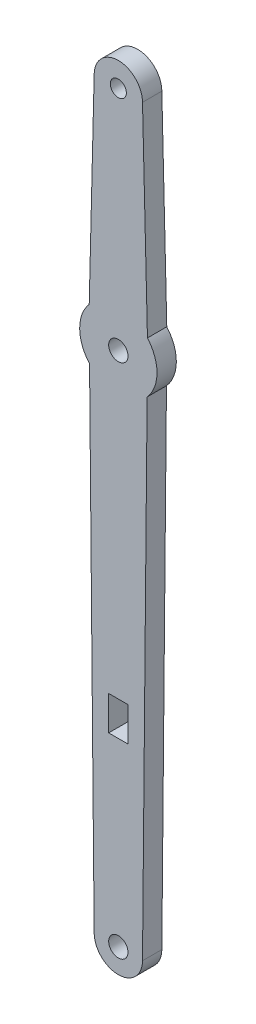
ISO-10303-21;
HEADER;
FILE_DESCRIPTION(('STEP AP214'),'2;1');
FILE_NAME('part.step','',(''),(''),'','','');
FILE_SCHEMA(('AUTOMOTIVE_DESIGN { 1 0 10303 214 1 1 1 1 }'));
ENDSEC;
DATA;
#1=APPLICATION_CONTEXT('core data for automotive mechanical design processes');
#2=APPLICATION_PROTOCOL_DEFINITION('international standard','automotive_design',2000,#1);
#3=PRODUCT_CONTEXT('',#1,'mechanical');
#4=PRODUCT('Part','Part','',(#3));
#5=PRODUCT_RELATED_PRODUCT_CATEGORY('part','',(#4));
#6=PRODUCT_DEFINITION_FORMATION('','',#4);
#7=PRODUCT_DEFINITION_CONTEXT('part definition',#1,'design');
#8=PRODUCT_DEFINITION('design','',#6,#7);
#9=PRODUCT_DEFINITION_SHAPE('','',#8);
#10=(LENGTH_UNIT() NAMED_UNIT(*) SI_UNIT(.MILLI.,.METRE.));
#11=(NAMED_UNIT(*) PLANE_ANGLE_UNIT() SI_UNIT($,.RADIAN.));
#12=(NAMED_UNIT(*) SI_UNIT($,.STERADIAN.) SOLID_ANGLE_UNIT());
#13=UNCERTAINTY_MEASURE_WITH_UNIT(LENGTH_MEASURE(1.E-05),#10,'distance_accuracy_value','');
#14=(GEOMETRIC_REPRESENTATION_CONTEXT(3) GLOBAL_UNCERTAINTY_ASSIGNED_CONTEXT((#13)) GLOBAL_UNIT_ASSIGNED_CONTEXT((#10,
#11,#12)) REPRESENTATION_CONTEXT('',''));
#15=CARTESIAN_POINT('',(0.,0.,0.));
#16=DIRECTION('',(0.,0.,1.));
#17=DIRECTION('',(1.,0.,0.));
#18=AXIS2_PLACEMENT_3D('',#15,#16,#17);
#19=CARTESIAN_POINT('',(202.82681688808,948.560738026491,-3.));
#20=DIRECTION('',(0.,0.,1.));
#21=DIRECTION('',(1.,0.,0.));
#22=AXIS2_PLACEMENT_3D('',#19,#20,#21);
#23=CYLINDRICAL_SURFACE('',#22,6.00000000000054);
#24=CARTESIAN_POINT('',(202.82681688808,948.560738026491,0.));
#25=DIRECTION('',(0.,0.,1.));
#26=DIRECTION('',(-1.,0.,0.));
#27=AXIS2_PLACEMENT_3D('',#24,#25,#26);
#28=CIRCLE('',#27,6.00000000000054);
#29=CARTESIAN_POINT('',(198.308869226963,952.508921017617,0.));
#30=VERTEX_POINT('',#29);
#31=CARTESIAN_POINT('',(198.360659981847,944.554063284401,0.));
#32=VERTEX_POINT('',#31);
#33=EDGE_CURVE('E179',#30,#32,#28,.T.);
#34=ORIENTED_EDGE('',*,*,#33,.F.);
#35=DIRECTION('',(0.,0.,1.));
#36=VECTOR('',#35,1.);
#37=CARTESIAN_POINT('',(198.308869226963,952.508921017617,-3.));
#38=LINE('',#37,#36);
#39=CARTESIAN_POINT('',(198.308869226963,952.508921017617,-3.));
#40=VERTEX_POINT('',#39);
#41=EDGE_CURVE('E11',#40,#30,#38,.T.);
#42=ORIENTED_EDGE('',*,*,#41,.F.);
#43=CARTESIAN_POINT('',(202.82681688808,948.560738026491,-3.));
#44=DIRECTION('',(0.,0.,1.));
#45=DIRECTION('',(-1.,0.,0.));
#46=AXIS2_PLACEMENT_3D('',#43,#44,#45);
#47=CIRCLE('',#46,6.00000000000054);
#48=CARTESIAN_POINT('',(198.360659981847,944.554063284401,-3.));
#49=VERTEX_POINT('',#48);
#50=EDGE_CURVE('E182',#40,#49,#47,.T.);
#51=ORIENTED_EDGE('',*,*,#50,.T.);
#52=DIRECTION('',(0.,0.,1.));
#53=VECTOR('',#52,1.);
#54=CARTESIAN_POINT('',(198.360659981847,944.554063284401,-3.));
#55=LINE('',#54,#53);
#56=EDGE_CURVE('E43',#49,#32,#55,.T.);
#57=ORIENTED_EDGE('',*,*,#56,.T.);
#58=EDGE_LOOP('',(#34,#42,#51,#57));
#59=FACE_BOUND('',#58,.T.);
#60=ADVANCED_FACE('F40',(#59),#23,.T.);
#61=CARTESIAN_POINT('',(198.308869226963,952.508921017617,-3.));
#62=DIRECTION('',(-0.99969884595477,0.0245401181069235,0.));
#63=DIRECTION('',(-0.0245401181069235,-0.99969884595477,0.));
#64=AXIS2_PLACEMENT_3D('',#61,#62,#63);
#65=PLANE('',#64);
#66=DIRECTION('',(-0.0245401181069235,-0.99969884595477,0.));
#67=VECTOR('',#66,1.);
#68=CARTESIAN_POINT('',(198.308869226963,952.508921017617,0.));
#69=LINE('',#68,#67);
#70=CARTESIAN_POINT('',(199.07681688808,983.793056946648,0.));
#71=VERTEX_POINT('',#70);
#72=EDGE_CURVE('E186',#71,#30,#69,.T.);
#73=ORIENTED_EDGE('',*,*,#72,.F.);
#74=DIRECTION('',(0.,0.,1.));
#75=VECTOR('',#74,1.);
#76=CARTESIAN_POINT('',(199.07681688808,983.793056946648,-3.));
#77=LINE('',#76,#75);
#78=CARTESIAN_POINT('',(199.07681688808,983.793056946648,-3.));
#79=VERTEX_POINT('',#78);
#80=EDGE_CURVE('E48',#79,#71,#77,.T.);
#81=ORIENTED_EDGE('',*,*,#80,.F.);
#82=DIRECTION('',(-0.0245401181069235,-0.99969884595477,0.));
#83=VECTOR('',#82,1.);
#84=CARTESIAN_POINT('',(198.308869226963,952.508921017617,-3.));
#85=LINE('',#84,#83);
#86=EDGE_CURVE('E204',#79,#40,#85,.T.);
#87=ORIENTED_EDGE('',*,*,#86,.T.);
#88=ORIENTED_EDGE('',*,*,#41,.T.);
#89=EDGE_LOOP('',(#73,#81,#87,#88));
#90=FACE_BOUND('',#89,.T.);
#91=ADVANCED_FACE('F251',(#90),#65,.T.);
#92=CARTESIAN_POINT('',(202.82681688808,983.793056946648,-3.));
#93=DIRECTION('',(0.,0.,1.));
#94=DIRECTION('',(1.,0.,0.));
#95=AXIS2_PLACEMENT_3D('',#92,#93,#94);
#96=CYLINDRICAL_SURFACE('',#95,3.75);
#97=CARTESIAN_POINT('',(202.82681688808,983.793056946648,0.));
#98=DIRECTION('',(0.,0.,1.));
#99=DIRECTION('',(-1.,0.,0.));
#100=AXIS2_PLACEMENT_3D('',#97,#98,#99);
#101=CIRCLE('',#100,3.75);
#102=CARTESIAN_POINT('',(206.57681688808,983.793056946648,0.));
#103=VERTEX_POINT('',#102);
#104=EDGE_CURVE('E224',#103,#71,#101,.T.);
#105=ORIENTED_EDGE('',*,*,#104,.F.);
#106=DIRECTION('',(0.,0.,1.));
#107=VECTOR('',#106,1.);
#108=CARTESIAN_POINT('',(206.57681688808,983.793056946648,-3.));
#109=LINE('',#108,#107);
#110=CARTESIAN_POINT('',(206.57681688808,983.793056946648,-3.));
#111=VERTEX_POINT('',#110);
#112=EDGE_CURVE('E230',#111,#103,#109,.T.);
#113=ORIENTED_EDGE('',*,*,#112,.F.);
#114=CARTESIAN_POINT('',(202.82681688808,983.793056946648,-3.));
#115=DIRECTION('',(0.,0.,1.));
#116=DIRECTION('',(-1.,0.,0.));
#117=AXIS2_PLACEMENT_3D('',#114,#115,#116);
#118=CIRCLE('',#117,3.75);
#119=EDGE_CURVE('E201',#111,#79,#118,.T.);
#120=ORIENTED_EDGE('',*,*,#119,.T.);
#121=ORIENTED_EDGE('',*,*,#80,.T.);
#122=EDGE_LOOP('',(#105,#113,#120,#121));
#123=FACE_BOUND('',#122,.T.);
#124=ADVANCED_FACE('F271',(#123),#96,.T.);
#125=CARTESIAN_POINT('',(207.344764549196,952.508921017617,-3.));
#126=DIRECTION('',(0.99969884595477,0.02454011810692,0.));
#127=DIRECTION('',(-0.02454011810692,0.99969884595477,0.));
#128=AXIS2_PLACEMENT_3D('',#125,#126,#127);
#129=PLANE('',#128);
#130=DIRECTION('',(-0.02454011810692,0.99969884595477,0.));
#131=VECTOR('',#130,1.);
#132=CARTESIAN_POINT('',(207.344764549196,952.508921017617,0.));
#133=LINE('',#132,#131);
#134=CARTESIAN_POINT('',(207.344764549196,952.508921017617,0.));
#135=VERTEX_POINT('',#134);
#136=EDGE_CURVE('E221',#135,#103,#133,.T.);
#137=ORIENTED_EDGE('',*,*,#136,.F.);
#138=DIRECTION('',(0.,0.,1.));
#139=VECTOR('',#138,1.);
#140=CARTESIAN_POINT('',(207.344764549196,952.508921017617,-3.));
#141=LINE('',#140,#139);
#142=CARTESIAN_POINT('',(207.344764549196,952.508921017617,-3.));
#143=VERTEX_POINT('',#142);
#144=EDGE_CURVE('E232',#143,#135,#141,.T.);
#145=ORIENTED_EDGE('',*,*,#144,.F.);
#146=DIRECTION('',(-0.02454011810692,0.99969884595477,0.));
#147=VECTOR('',#146,1.);
#148=CARTESIAN_POINT('',(207.344764549196,952.508921017617,-3.));
#149=LINE('',#148,#147);
#150=EDGE_CURVE('E198',#143,#111,#149,.T.);
#151=ORIENTED_EDGE('',*,*,#150,.T.);
#152=ORIENTED_EDGE('',*,*,#112,.T.);
#153=EDGE_LOOP('',(#137,#145,#151,#152));
#154=FACE_BOUND('',#153,.T.);
#155=ADVANCED_FACE('F269',(#154),#129,.T.);
#156=CARTESIAN_POINT('',(202.82681688808,948.560738026492,-3.));
#157=DIRECTION('',(0.,0.,1.));
#158=DIRECTION('',(1.,0.,0.));
#159=AXIS2_PLACEMENT_3D('',#156,#157,#158);
#160=CYLINDRICAL_SURFACE('',#159,5.99999999999978);
#161=CARTESIAN_POINT('',(202.82681688808,948.560738026492,0.));
#162=DIRECTION('',(0.,0.,1.));
#163=DIRECTION('',(-1.,0.,0.));
#164=AXIS2_PLACEMENT_3D('',#161,#162,#163);
#165=CIRCLE('',#164,5.99999999999978);
#166=CARTESIAN_POINT('',(207.294357708213,944.555606440583,0.));
#167=VERTEX_POINT('',#166);
#168=EDGE_CURVE('E218',#167,#135,#165,.T.);
#169=ORIENTED_EDGE('',*,*,#168,.F.);
#170=DIRECTION('',(0.,0.,1.));
#171=VECTOR('',#170,1.);
#172=CARTESIAN_POINT('',(207.294357708213,944.555606440583,-3.));
#173=LINE('',#172,#171);
#174=CARTESIAN_POINT('',(207.294357708213,944.555606440583,-3.));
#175=VERTEX_POINT('',#174);
#176=EDGE_CURVE('E234',#175,#167,#173,.T.);
#177=ORIENTED_EDGE('',*,*,#176,.F.);
#178=CARTESIAN_POINT('',(202.82681688808,948.560738026492,-3.));
#179=DIRECTION('',(0.,0.,1.));
#180=DIRECTION('',(-1.,0.,0.));
#181=AXIS2_PLACEMENT_3D('',#178,#179,#180);
#182=CIRCLE('',#181,5.99999999999978);
#183=EDGE_CURVE('E195',#175,#143,#182,.T.);
#184=ORIENTED_EDGE('',*,*,#183,.T.);
#185=ORIENTED_EDGE('',*,*,#144,.T.);
#186=EDGE_LOOP('',(#169,#177,#184,#185));
#187=FACE_BOUND('',#186,.T.);
#188=ADVANCED_FACE('F265',(#187),#160,.T.);
#189=CARTESIAN_POINT('',(207.294357708213,944.555606440583,-3.));
#190=DIRECTION('',(0.99995558710895,-0.00942463843314179,0.));
#191=DIRECTION('',(0.00942463843314179,0.99995558710895,0.));
#192=AXIS2_PLACEMENT_3D('',#189,#190,#191);
#193=PLANE('',#192);
#194=DIRECTION('',(0.00942463843314179,0.99995558710895,0.));
#195=VECTOR('',#194,1.);
#196=CARTESIAN_POINT('',(207.294357708213,944.555606440583,0.));
#197=LINE('',#196,#195);
#198=CARTESIAN_POINT('',(206.57681688808,868.424415078559,0.));
#199=VERTEX_POINT('',#198);
#200=EDGE_CURVE('E215',#199,#167,#197,.T.);
#201=ORIENTED_EDGE('',*,*,#200,.F.);
#202=DIRECTION('',(0.,0.,1.));
#203=VECTOR('',#202,1.);
#204=CARTESIAN_POINT('',(206.57681688808,868.424415078559,-3.));
#205=LINE('',#204,#203);
#206=CARTESIAN_POINT('',(206.57681688808,868.424415078559,-3.));
#207=VERTEX_POINT('',#206);
#208=EDGE_CURVE('E236',#207,#199,#205,.T.);
#209=ORIENTED_EDGE('',*,*,#208,.F.);
#210=DIRECTION('',(0.00942463843314179,0.99995558710895,0.));
#211=VECTOR('',#210,1.);
#212=CARTESIAN_POINT('',(207.294357708213,944.555606440583,-3.));
#213=LINE('',#212,#211);
#214=EDGE_CURVE('E192',#207,#175,#213,.T.);
#215=ORIENTED_EDGE('',*,*,#214,.T.);
#216=ORIENTED_EDGE('',*,*,#176,.T.);
#217=EDGE_LOOP('',(#201,#209,#215,#216));
#218=FACE_BOUND('',#217,.T.);
#219=ADVANCED_FACE('F263',(#218),#193,.T.);
#220=CARTESIAN_POINT('',(202.82681688808,868.42441507856,-3.));
#221=DIRECTION('',(0.,0.,1.));
#222=DIRECTION('',(1.,0.,0.));
#223=AXIS2_PLACEMENT_3D('',#220,#221,#222);
#224=CYLINDRICAL_SURFACE('',#223,3.75);
#225=CARTESIAN_POINT('',(202.82681688808,868.42441507856,0.));
#226=DIRECTION('',(0.,0.,1.));
#227=DIRECTION('',(1.,0.,0.));
#228=AXIS2_PLACEMENT_3D('',#225,#226,#227);
#229=CIRCLE('',#228,3.75);
#230=CARTESIAN_POINT('',(199.07681688808,868.424415078559,0.));
#231=VERTEX_POINT('',#230);
#232=EDGE_CURVE('E212',#231,#199,#229,.T.);
#233=ORIENTED_EDGE('',*,*,#232,.F.);
#234=DIRECTION('',(0.,0.,1.));
#235=VECTOR('',#234,1.);
#236=CARTESIAN_POINT('',(199.07681688808,868.424415078559,-3.));
#237=LINE('',#236,#235);
#238=CARTESIAN_POINT('',(199.07681688808,868.424415078559,-3.));
#239=VERTEX_POINT('',#238);
#240=EDGE_CURVE('E237',#239,#231,#237,.T.);
#241=ORIENTED_EDGE('',*,*,#240,.F.);
#242=CARTESIAN_POINT('',(202.82681688808,868.42441507856,-3.));
#243=DIRECTION('',(0.,0.,1.));
#244=DIRECTION('',(1.,0.,0.));
#245=AXIS2_PLACEMENT_3D('',#242,#243,#244);
#246=CIRCLE('',#245,3.75);
#247=EDGE_CURVE('E189',#239,#207,#246,.T.);
#248=ORIENTED_EDGE('',*,*,#247,.T.);
#249=ORIENTED_EDGE('',*,*,#208,.T.);
#250=EDGE_LOOP('',(#233,#241,#248,#249));
#251=FACE_BOUND('',#250,.T.);
#252=ADVANCED_FACE('F259',(#251),#224,.T.);
#253=CARTESIAN_POINT('',(198.360659981847,944.554063284401,-3.));
#254=DIRECTION('',(-0.999955756456323,-0.00940665348902177,0.));
#255=DIRECTION('',(0.00940665348902177,-0.999955756456323,0.));
#256=AXIS2_PLACEMENT_3D('',#253,#254,#255);
#257=PLANE('',#256);
#258=DIRECTION('',(0.00940665348902177,-0.999955756456323,0.));
#259=VECTOR('',#258,1.);
#260=CARTESIAN_POINT('',(198.360659981847,944.554063284401,0.));
#261=LINE('',#260,#259);
#262=EDGE_CURVE('E209',#32,#231,#261,.T.);
#263=ORIENTED_EDGE('',*,*,#262,.F.);
#264=ORIENTED_EDGE('',*,*,#56,.F.);
#265=DIRECTION('',(0.00940665348902177,-0.999955756456323,0.));
#266=VECTOR('',#265,1.);
#267=CARTESIAN_POINT('',(198.360659981847,944.554063284401,-3.));
#268=LINE('',#267,#266);
#269=EDGE_CURVE('E185',#49,#239,#268,.T.);
#270=ORIENTED_EDGE('',*,*,#269,.T.);
#271=ORIENTED_EDGE('',*,*,#240,.T.);
#272=EDGE_LOOP('',(#263,#264,#270,#271));
#273=FACE_BOUND('',#272,.T.);
#274=ADVANCED_FACE('F245',(#273),#257,.T.);
#275=CARTESIAN_POINT('',(202.82681688808,948.560738026491,-3.));
#276=DIRECTION('',(0.,0.,-1.));
#277=DIRECTION('',(-1.,0.,0.));
#278=AXIS2_PLACEMENT_3D('',#275,#276,#277);
#279=PLANE('',#278);
#280=CARTESIAN_POINT('',(202.82681688808,868.424415078559,-3.));
#281=DIRECTION('',(0.,0.,1.));
#282=DIRECTION('',(1.,0.,0.));
#283=AXIS2_PLACEMENT_3D('',#280,#281,#282);
#284=CIRCLE('',#283,1.5);
#285=CARTESIAN_POINT('',(204.32681688808,868.424415078559,-3.));
#286=VERTEX_POINT('',#285);
#287=EDGE_CURVE('E160',#286,#286,#284,.T.);
#288=ORIENTED_EDGE('',*,*,#287,.T.);
#289=EDGE_LOOP('',(#288));
#290=FACE_BOUND('',#289,.T.);
#291=DIRECTION('',(0.,-1.,0.));
#292=VECTOR('',#291,1.);
#293=CARTESIAN_POINT('',(201.326816888079,901.724415078559,-3.));
#294=LINE('',#293,#292);
#295=CARTESIAN_POINT('',(201.326816888079,901.724415078559,-3.));
#296=VERTEX_POINT('',#295);
#297=CARTESIAN_POINT('',(201.326816888079,896.424415078559,-3.));
#298=VERTEX_POINT('',#297);
#299=EDGE_CURVE('E131',#296,#298,#294,.T.);
#300=ORIENTED_EDGE('',*,*,#299,.T.);
#301=DIRECTION('',(1.,0.,0.));
#302=VECTOR('',#301,1.);
#303=CARTESIAN_POINT('',(201.326816888079,896.424415078559,-3.));
#304=LINE('',#303,#302);
#305=CARTESIAN_POINT('',(204.326816888079,896.424415078559,-3.));
#306=VERTEX_POINT('',#305);
#307=EDGE_CURVE('E140',#298,#306,#304,.T.);
#308=ORIENTED_EDGE('',*,*,#307,.T.);
#309=DIRECTION('',(0.,1.,0.));
#310=VECTOR('',#309,1.);
#311=CARTESIAN_POINT('',(204.326816888079,901.724415078559,-3.));
#312=LINE('',#311,#310);
#313=CARTESIAN_POINT('',(204.326816888079,901.724415078559,-3.));
#314=VERTEX_POINT('',#313);
#315=EDGE_CURVE('E56',#306,#314,#312,.T.);
#316=ORIENTED_EDGE('',*,*,#315,.T.);
#317=DIRECTION('',(-1.,0.,0.));
#318=VECTOR('',#317,1.);
#319=CARTESIAN_POINT('',(201.326816888079,901.724415078559,-3.));
#320=LINE('',#319,#318);
#321=EDGE_CURVE('E137',#314,#296,#320,.T.);
#322=ORIENTED_EDGE('',*,*,#321,.T.);
#323=EDGE_LOOP('',(#300,#308,#316,#322));
#324=FACE_BOUND('',#323,.T.);
#325=CARTESIAN_POINT('',(202.82681688808,948.560738026491,-3.));
#326=DIRECTION('',(0.,0.,1.));
#327=DIRECTION('',(1.,0.,0.));
#328=AXIS2_PLACEMENT_3D('',#325,#326,#327);
#329=CIRCLE('',#328,1.5);
#330=CARTESIAN_POINT('',(204.32681688808,948.560738026491,-3.));
#331=VERTEX_POINT('',#330);
#332=EDGE_CURVE('E170',#331,#331,#329,.T.);
#333=ORIENTED_EDGE('',*,*,#332,.T.);
#334=EDGE_LOOP('',(#333));
#335=FACE_BOUND('',#334,.T.);
#336=CARTESIAN_POINT('',(202.82681688808,983.793056946648,-3.));
#337=DIRECTION('',(0.,0.,1.));
#338=DIRECTION('',(1.,0.,0.));
#339=AXIS2_PLACEMENT_3D('',#336,#337,#338);
#340=CIRCLE('',#339,1.25);
#341=CARTESIAN_POINT('',(204.07681688808,983.793056946648,-3.));
#342=VERTEX_POINT('',#341);
#343=EDGE_CURVE('E176',#342,#342,#340,.T.);
#344=ORIENTED_EDGE('',*,*,#343,.T.);
#345=EDGE_LOOP('',(#344));
#346=FACE_BOUND('',#345,.T.);
#347=ORIENTED_EDGE('',*,*,#50,.F.);
#348=ORIENTED_EDGE('',*,*,#86,.F.);
#349=ORIENTED_EDGE('',*,*,#119,.F.);
#350=ORIENTED_EDGE('',*,*,#150,.F.);
#351=ORIENTED_EDGE('',*,*,#183,.F.);
#352=ORIENTED_EDGE('',*,*,#214,.F.);
#353=ORIENTED_EDGE('',*,*,#247,.F.);
#354=ORIENTED_EDGE('',*,*,#269,.F.);
#355=EDGE_LOOP('',(#347,#348,#349,#350,#351,#352,#353,#354));
#356=FACE_BOUND('',#355,.T.);
#357=ADVANCED_FACE('F144',(#290,#324,#335,#346,#356),#279,.T.);
#358=CARTESIAN_POINT('',(202.82681688808,948.560738026491,0.));
#359=DIRECTION('',(0.,0.,-1.));
#360=DIRECTION('',(-1.,0.,0.));
#361=AXIS2_PLACEMENT_3D('',#358,#359,#360);
#362=PLANE('',#361);
#363=CARTESIAN_POINT('',(202.82681688808,868.424415078559,0.));
#364=DIRECTION('',(0.,0.,1.));
#365=DIRECTION('',(1.,0.,0.));
#366=AXIS2_PLACEMENT_3D('',#363,#364,#365);
#367=CIRCLE('',#366,1.5);
#368=CARTESIAN_POINT('',(204.32681688808,868.424415078559,0.));
#369=VERTEX_POINT('',#368);
#370=EDGE_CURVE('E153',#369,#369,#367,.T.);
#371=ORIENTED_EDGE('',*,*,#370,.F.);
#372=EDGE_LOOP('',(#371));
#373=FACE_BOUND('',#372,.T.);
#374=DIRECTION('',(1.,0.,0.));
#375=VECTOR('',#374,1.);
#376=CARTESIAN_POINT('',(201.326816888079,896.424415078559,0.));
#377=LINE('',#376,#375);
#378=CARTESIAN_POINT('',(201.326816888079,896.424415078559,0.));
#379=VERTEX_POINT('',#378);
#380=CARTESIAN_POINT('',(204.326816888079,896.424415078559,0.));
#381=VERTEX_POINT('',#380);
#382=EDGE_CURVE('E159',#379,#381,#377,.T.);
#383=ORIENTED_EDGE('',*,*,#382,.F.);
#384=DIRECTION('',(0.,-1.,0.));
#385=VECTOR('',#384,1.);
#386=CARTESIAN_POINT('',(201.326816888079,901.724415078559,0.));
#387=LINE('',#386,#385);
#388=CARTESIAN_POINT('',(201.326816888079,901.724415078559,0.));
#389=VERTEX_POINT('',#388);
#390=EDGE_CURVE('E64',#389,#379,#387,.T.);
#391=ORIENTED_EDGE('',*,*,#390,.F.);
#392=DIRECTION('',(-1.,0.,0.));
#393=VECTOR('',#392,1.);
#394=CARTESIAN_POINT('',(201.326816888079,901.724415078559,0.));
#395=LINE('',#394,#393);
#396=CARTESIAN_POINT('',(204.326816888079,901.724415078559,0.));
#397=VERTEX_POINT('',#396);
#398=EDGE_CURVE('E147',#397,#389,#395,.T.);
#399=ORIENTED_EDGE('',*,*,#398,.F.);
#400=DIRECTION('',(0.,1.,0.));
#401=VECTOR('',#400,1.);
#402=CARTESIAN_POINT('',(204.326816888079,901.724415078559,0.));
#403=LINE('',#402,#401);
#404=EDGE_CURVE('E150',#381,#397,#403,.T.);
#405=ORIENTED_EDGE('',*,*,#404,.F.);
#406=EDGE_LOOP('',(#383,#391,#399,#405));
#407=FACE_BOUND('',#406,.T.);
#408=CARTESIAN_POINT('',(202.82681688808,948.560738026491,0.));
#409=DIRECTION('',(0.,0.,1.));
#410=DIRECTION('',(1.,0.,0.));
#411=AXIS2_PLACEMENT_3D('',#408,#409,#410);
#412=CIRCLE('',#411,1.5);
#413=CARTESIAN_POINT('',(204.32681688808,948.560738026491,0.));
#414=VERTEX_POINT('',#413);
#415=EDGE_CURVE('E166',#414,#414,#412,.T.);
#416=ORIENTED_EDGE('',*,*,#415,.F.);
#417=EDGE_LOOP('',(#416));
#418=FACE_BOUND('',#417,.T.);
#419=CARTESIAN_POINT('',(202.82681688808,983.793056946648,0.));
#420=DIRECTION('',(0.,0.,1.));
#421=DIRECTION('',(1.,0.,0.));
#422=AXIS2_PLACEMENT_3D('',#419,#420,#421);
#423=CIRCLE('',#422,1.25);
#424=CARTESIAN_POINT('',(204.07681688808,983.793056946648,0.));
#425=VERTEX_POINT('',#424);
#426=EDGE_CURVE('E173',#425,#425,#423,.T.);
#427=ORIENTED_EDGE('',*,*,#426,.F.);
#428=EDGE_LOOP('',(#427));
#429=FACE_BOUND('',#428,.T.);
#430=ORIENTED_EDGE('',*,*,#33,.T.);
#431=ORIENTED_EDGE('',*,*,#262,.T.);
#432=ORIENTED_EDGE('',*,*,#232,.T.);
#433=ORIENTED_EDGE('',*,*,#200,.T.);
#434=ORIENTED_EDGE('',*,*,#168,.T.);
#435=ORIENTED_EDGE('',*,*,#136,.T.);
#436=ORIENTED_EDGE('',*,*,#104,.T.);
#437=ORIENTED_EDGE('',*,*,#72,.T.);
#438=EDGE_LOOP('',(#430,#431,#432,#433,#434,#435,#436,#437));
#439=FACE_BOUND('',#438,.T.);
#440=ADVANCED_FACE('F247',(#373,#407,#418,#429,#439),#362,.F.);
#441=CARTESIAN_POINT('',(202.82681688808,983.793056946648,-3.));
#442=DIRECTION('',(0.,0.,1.));
#443=DIRECTION('',(1.,0.,0.));
#444=AXIS2_PLACEMENT_3D('',#441,#442,#443);
#445=CYLINDRICAL_SURFACE('',#444,1.25);
#446=ORIENTED_EDGE('',*,*,#343,.F.);
#447=EDGE_LOOP('',(#446));
#448=FACE_BOUND('',#447,.T.);
#449=ORIENTED_EDGE('',*,*,#426,.T.);
#450=EDGE_LOOP('',(#449));
#451=FACE_BOUND('',#450,.T.);
#452=ADVANCED_FACE('F354',(#448,#451),#445,.F.);
#453=CARTESIAN_POINT('',(202.82681688808,948.560738026491,-3.));
#454=DIRECTION('',(0.,0.,1.));
#455=DIRECTION('',(1.,0.,0.));
#456=AXIS2_PLACEMENT_3D('',#453,#454,#455);
#457=CYLINDRICAL_SURFACE('',#456,1.5);
#458=ORIENTED_EDGE('',*,*,#332,.F.);
#459=EDGE_LOOP('',(#458));
#460=FACE_BOUND('',#459,.T.);
#461=ORIENTED_EDGE('',*,*,#415,.T.);
#462=EDGE_LOOP('',(#461));
#463=FACE_BOUND('',#462,.T.);
#464=ADVANCED_FACE('F365',(#460,#463),#457,.F.);
#465=CARTESIAN_POINT('',(201.326816888079,901.724415078559,-3.));
#466=DIRECTION('',(-1.,0.,0.));
#467=DIRECTION('',(0.,-1.,0.));
#468=AXIS2_PLACEMENT_3D('',#465,#466,#467);
#469=PLANE('',#468);
#470=ORIENTED_EDGE('',*,*,#390,.T.);
#471=DIRECTION('',(0.,0.,1.));
#472=VECTOR('',#471,1.);
#473=CARTESIAN_POINT('',(201.326816888079,896.424415078559,-3.));
#474=LINE('',#473,#472);
#475=EDGE_CURVE('E127',#298,#379,#474,.T.);
#476=ORIENTED_EDGE('',*,*,#475,.F.);
#477=ORIENTED_EDGE('',*,*,#299,.F.);
#478=DIRECTION('',(0.,0.,1.));
#479=VECTOR('',#478,1.);
#480=CARTESIAN_POINT('',(201.326816888079,901.724415078559,-3.));
#481=LINE('',#480,#479);
#482=EDGE_CURVE('E164',#296,#389,#481,.T.);
#483=ORIENTED_EDGE('',*,*,#482,.T.);
#484=EDGE_LOOP('',(#470,#476,#477,#483));
#485=FACE_BOUND('',#484,.T.);
#486=ADVANCED_FACE('F129',(#485),#469,.F.);
#487=CARTESIAN_POINT('',(201.326816888079,901.724415078559,-3.));
#488=DIRECTION('',(0.,1.,0.));
#489=DIRECTION('',(0.,0.,1.));
#490=AXIS2_PLACEMENT_3D('',#487,#488,#489);
#491=PLANE('',#490);
#492=ORIENTED_EDGE('',*,*,#398,.T.);
#493=ORIENTED_EDGE('',*,*,#482,.F.);
#494=ORIENTED_EDGE('',*,*,#321,.F.);
#495=DIRECTION('',(0.,0.,1.));
#496=VECTOR('',#495,1.);
#497=CARTESIAN_POINT('',(204.326816888079,901.724415078559,-3.));
#498=LINE('',#497,#496);
#499=EDGE_CURVE('E167',#314,#397,#498,.T.);
#500=ORIENTED_EDGE('',*,*,#499,.T.);
#501=EDGE_LOOP('',(#492,#493,#494,#500));
#502=FACE_BOUND('',#501,.T.);
#503=ADVANCED_FACE('F386',(#502),#491,.F.);
#504=CARTESIAN_POINT('',(204.326816888079,901.724415078559,-3.));
#505=DIRECTION('',(1.,0.,0.));
#506=DIRECTION('',(0.,0.,-1.));
#507=AXIS2_PLACEMENT_3D('',#504,#505,#506);
#508=PLANE('',#507);
#509=ORIENTED_EDGE('',*,*,#404,.T.);
#510=ORIENTED_EDGE('',*,*,#499,.F.);
#511=ORIENTED_EDGE('',*,*,#315,.F.);
#512=DIRECTION('',(0.,0.,1.));
#513=VECTOR('',#512,1.);
#514=CARTESIAN_POINT('',(204.326816888079,896.424415078559,-3.));
#515=LINE('',#514,#513);
#516=EDGE_CURVE('E136',#306,#381,#515,.T.);
#517=ORIENTED_EDGE('',*,*,#516,.T.);
#518=EDGE_LOOP('',(#509,#510,#511,#517));
#519=FACE_BOUND('',#518,.T.);
#520=ADVANCED_FACE('F396',(#519),#508,.F.);
#521=CARTESIAN_POINT('',(201.326816888079,896.424415078559,-3.));
#522=DIRECTION('',(0.,-1.,0.));
#523=DIRECTION('',(0.,0.,-1.));
#524=AXIS2_PLACEMENT_3D('',#521,#522,#523);
#525=PLANE('',#524);
#526=ORIENTED_EDGE('',*,*,#382,.T.);
#527=ORIENTED_EDGE('',*,*,#516,.F.);
#528=ORIENTED_EDGE('',*,*,#307,.F.);
#529=ORIENTED_EDGE('',*,*,#475,.T.);
#530=EDGE_LOOP('',(#526,#527,#528,#529));
#531=FACE_BOUND('',#530,.T.);
#532=ADVANCED_FACE('F141',(#531),#525,.F.);
#533=CARTESIAN_POINT('',(202.82681688808,868.424415078559,-3.));
#534=DIRECTION('',(0.,0.,1.));
#535=DIRECTION('',(1.,0.,0.));
#536=AXIS2_PLACEMENT_3D('',#533,#534,#535);
#537=CYLINDRICAL_SURFACE('',#536,1.5);
#538=ORIENTED_EDGE('',*,*,#287,.F.);
#539=EDGE_LOOP('',(#538));
#540=FACE_BOUND('',#539,.T.);
#541=ORIENTED_EDGE('',*,*,#370,.T.);
#542=EDGE_LOOP('',(#541));
#543=FACE_BOUND('',#542,.T.);
#544=ADVANCED_FACE('F416',(#540,#543),#537,.F.);
#545=CLOSED_SHELL('',(#60,#91,#124,#155,#188,#219,#252,#274,#357,#440,#452,#464,#486,#503,#520,
#532,#544));
#546=MANIFOLD_SOLID_BREP('B2',#545);
#547=ADVANCED_BREP_SHAPE_REPRESENTATION('',(#18,#546),#14);
#548=SHAPE_DEFINITION_REPRESENTATION(#9,#547);
ENDSEC;
END-ISO-10303-21;
